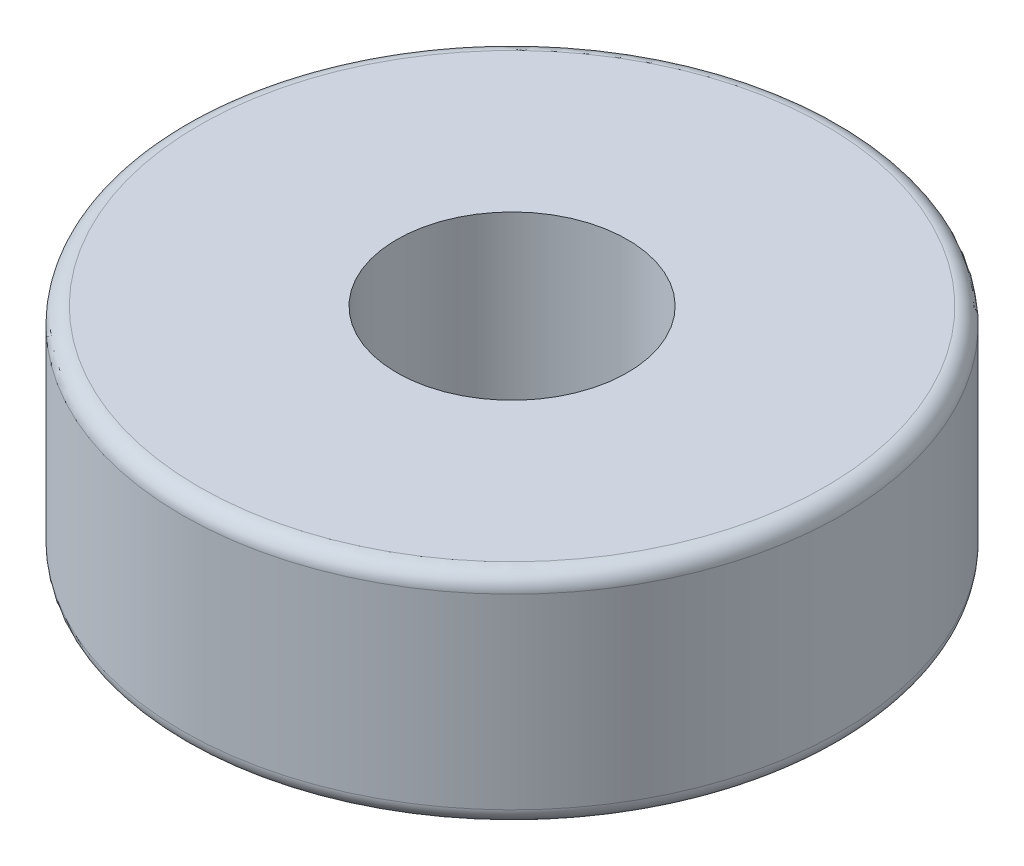
ISO-10303-21;
HEADER;
FILE_DESCRIPTION(('STEP AP214'),'2;1');
FILE_NAME('part.step','',(''),(''),'','','');
FILE_SCHEMA(('AUTOMOTIVE_DESIGN { 1 0 10303 214 1 1 1 1 }'));
ENDSEC;
DATA;
#1=APPLICATION_CONTEXT('core data for automotive mechanical design processes');
#2=APPLICATION_PROTOCOL_DEFINITION('international standard','automotive_design',2000,#1);
#3=PRODUCT_CONTEXT('',#1,'mechanical');
#4=PRODUCT('Part','Part','',(#3));
#5=PRODUCT_RELATED_PRODUCT_CATEGORY('part','',(#4));
#6=PRODUCT_DEFINITION_FORMATION('','',#4);
#7=PRODUCT_DEFINITION_CONTEXT('part definition',#1,'design');
#8=PRODUCT_DEFINITION('design','',#6,#7);
#9=PRODUCT_DEFINITION_SHAPE('','',#8);
#10=(LENGTH_UNIT() NAMED_UNIT(*) SI_UNIT(.MILLI.,.METRE.));
#11=(NAMED_UNIT(*) PLANE_ANGLE_UNIT() SI_UNIT($,.RADIAN.));
#12=(NAMED_UNIT(*) SI_UNIT($,.STERADIAN.) SOLID_ANGLE_UNIT());
#13=UNCERTAINTY_MEASURE_WITH_UNIT(LENGTH_MEASURE(1.E-05),#10,'distance_accuracy_value','');
#14=(GEOMETRIC_REPRESENTATION_CONTEXT(3) GLOBAL_UNCERTAINTY_ASSIGNED_CONTEXT((#13)) GLOBAL_UNIT_ASSIGNED_CONTEXT((#10,
#11,#12)) REPRESENTATION_CONTEXT('',''));
#15=CARTESIAN_POINT('',(0.,0.,0.));
#16=DIRECTION('',(0.,0.,1.));
#17=DIRECTION('',(1.,0.,0.));
#18=AXIS2_PLACEMENT_3D('',#15,#16,#17);
#19=CARTESIAN_POINT('',(0.,20.,0.));
#20=DIRECTION('',(0.,1.,0.));
#21=DIRECTION('',(0.,0.,1.));
#22=AXIS2_PLACEMENT_3D('',#19,#20,#21);
#23=PLANE('',#22);
#24=CARTESIAN_POINT('',(0.,20.,0.));
#25=DIRECTION('',(0.,1.,0.));
#26=DIRECTION('',(0.,0.,1.));
#27=AXIS2_PLACEMENT_3D('',#24,#25,#26);
#28=CIRCLE('',#27,28.5);
#29=CARTESIAN_POINT('',(0.,20.,28.5));
#30=VERTEX_POINT('',#29);
#31=EDGE_CURVE('E10',#30,#30,#28,.T.);
#32=ORIENTED_EDGE('',*,*,#31,.T.);
#33=EDGE_LOOP('',(#32));
#34=FACE_BOUND('',#33,.T.);
#35=CARTESIAN_POINT('',(0.,20.,0.));
#36=DIRECTION('',(0.,1.,0.));
#37=DIRECTION('',(0.,0.,1.));
#38=AXIS2_PLACEMENT_3D('',#35,#36,#37);
#39=CIRCLE('',#38,10.5);
#40=CARTESIAN_POINT('',(0.,20.,10.5));
#41=VERTEX_POINT('',#40);
#42=EDGE_CURVE('E53',#41,#41,#39,.T.);
#43=ORIENTED_EDGE('',*,*,#42,.F.);
#44=EDGE_LOOP('',(#43));
#45=FACE_BOUND('',#44,.T.);
#46=ADVANCED_FACE('F33',(#34,#45),#23,.T.);
#47=CARTESIAN_POINT('',(0.,0.,0.));
#48=DIRECTION('',(0.,1.,0.));
#49=DIRECTION('',(0.,0.,1.));
#50=AXIS2_PLACEMENT_3D('',#47,#48,#49);
#51=PLANE('',#50);
#52=CARTESIAN_POINT('',(0.,0.,0.));
#53=DIRECTION('',(0.,1.,0.));
#54=DIRECTION('',(0.,0.,1.));
#55=AXIS2_PLACEMENT_3D('',#52,#53,#54);
#56=CIRCLE('',#55,28.5);
#57=CARTESIAN_POINT('',(0.,0.,28.5));
#58=VERTEX_POINT('',#57);
#59=EDGE_CURVE('E40',#58,#58,#56,.F.);
#60=ORIENTED_EDGE('',*,*,#59,.T.);
#61=EDGE_LOOP('',(#60));
#62=FACE_BOUND('',#61,.T.);
#63=CARTESIAN_POINT('',(0.,0.,0.));
#64=DIRECTION('',(0.,1.,0.));
#65=DIRECTION('',(0.,0.,1.));
#66=AXIS2_PLACEMENT_3D('',#63,#64,#65);
#67=CIRCLE('',#66,10.5);
#68=CARTESIAN_POINT('',(0.,0.,10.5));
#69=VERTEX_POINT('',#68);
#70=EDGE_CURVE('E54',#69,#69,#67,.T.);
#71=ORIENTED_EDGE('',*,*,#70,.T.);
#72=EDGE_LOOP('',(#71));
#73=FACE_BOUND('',#72,.T.);
#74=ADVANCED_FACE('F64',(#62,#73),#51,.F.);
#75=CARTESIAN_POINT('',(0.,20.,0.));
#76=DIRECTION('',(0.,-1.,0.));
#77=DIRECTION('',(0.,0.,-1.));
#78=AXIS2_PLACEMENT_3D('',#75,#76,#77);
#79=CYLINDRICAL_SURFACE('',#78,30.);
#80=CARTESIAN_POINT('',(0.,1.5,0.));
#81=DIRECTION('',(0.,1.,0.));
#82=DIRECTION('',(0.,0.,1.));
#83=AXIS2_PLACEMENT_3D('',#80,#81,#82);
#84=CIRCLE('',#83,30.);
#85=CARTESIAN_POINT('',(0.,1.5,30.));
#86=VERTEX_POINT('',#85);
#87=EDGE_CURVE('E44',#86,#86,#84,.T.);
#88=ORIENTED_EDGE('',*,*,#87,.T.);
#89=EDGE_LOOP('',(#88));
#90=FACE_BOUND('',#89,.T.);
#91=CARTESIAN_POINT('',(0.,18.5,0.));
#92=DIRECTION('',(0.,1.,0.));
#93=DIRECTION('',(0.,0.,1.));
#94=AXIS2_PLACEMENT_3D('',#91,#92,#93);
#95=CIRCLE('',#94,30.);
#96=CARTESIAN_POINT('',(0.,18.5,30.));
#97=VERTEX_POINT('',#96);
#98=EDGE_CURVE('E48',#97,#97,#95,.F.);
#99=ORIENTED_EDGE('',*,*,#98,.T.);
#100=EDGE_LOOP('',(#99));
#101=FACE_BOUND('',#100,.T.);
#102=ADVANCED_FACE('F69',(#90,#101),#79,.T.);
#103=CARTESIAN_POINT('',(0.,20.,0.));
#104=DIRECTION('',(0.,-1.,0.));
#105=DIRECTION('',(0.,0.,-1.));
#106=AXIS2_PLACEMENT_3D('',#103,#104,#105);
#107=CYLINDRICAL_SURFACE('',#106,10.5);
#108=ORIENTED_EDGE('',*,*,#42,.T.);
#109=EDGE_LOOP('',(#108));
#110=FACE_BOUND('',#109,.T.);
#111=ORIENTED_EDGE('',*,*,#70,.F.);
#112=EDGE_LOOP('',(#111));
#113=FACE_BOUND('',#112,.T.);
#114=ADVANCED_FACE('F60',(#110,#113),#107,.F.);
#115=CARTESIAN_POINT('',(0.,1.5,0.));
#116=DIRECTION('',(0.,1.,0.));
#117=DIRECTION('',(0.,0.,1.));
#118=AXIS2_PLACEMENT_3D('',#115,#116,#117);
#119=TOROIDAL_SURFACE('',#118,28.5,1.5);
#120=ORIENTED_EDGE('',*,*,#59,.F.);
#121=EDGE_LOOP('',(#120));
#122=FACE_BOUND('',#121,.T.);
#123=ORIENTED_EDGE('',*,*,#87,.F.);
#124=EDGE_LOOP('',(#123));
#125=FACE_BOUND('',#124,.T.);
#126=ADVANCED_FACE('F75',(#122,#125),#119,.T.);
#127=CARTESIAN_POINT('',(0.,18.5,0.));
#128=DIRECTION('',(0.,1.,0.));
#129=DIRECTION('',(0.,0.,1.));
#130=AXIS2_PLACEMENT_3D('',#127,#128,#129);
#131=TOROIDAL_SURFACE('',#130,28.5,1.5);
#132=ORIENTED_EDGE('',*,*,#98,.F.);
#133=EDGE_LOOP('',(#132));
#134=FACE_BOUND('',#133,.T.);
#135=ORIENTED_EDGE('',*,*,#31,.F.);
#136=EDGE_LOOP('',(#135));
#137=FACE_BOUND('',#136,.T.);
#138=ADVANCED_FACE('F35',(#134,#137),#131,.T.);
#139=CLOSED_SHELL('',(#46,#74,#102,#114,#126,#138));
#140=MANIFOLD_SOLID_BREP('B2',#139);
#141=ADVANCED_BREP_SHAPE_REPRESENTATION('',(#18,#140),#14);
#142=SHAPE_DEFINITION_REPRESENTATION(#9,#141);
ENDSEC;
END-ISO-10303-21;
